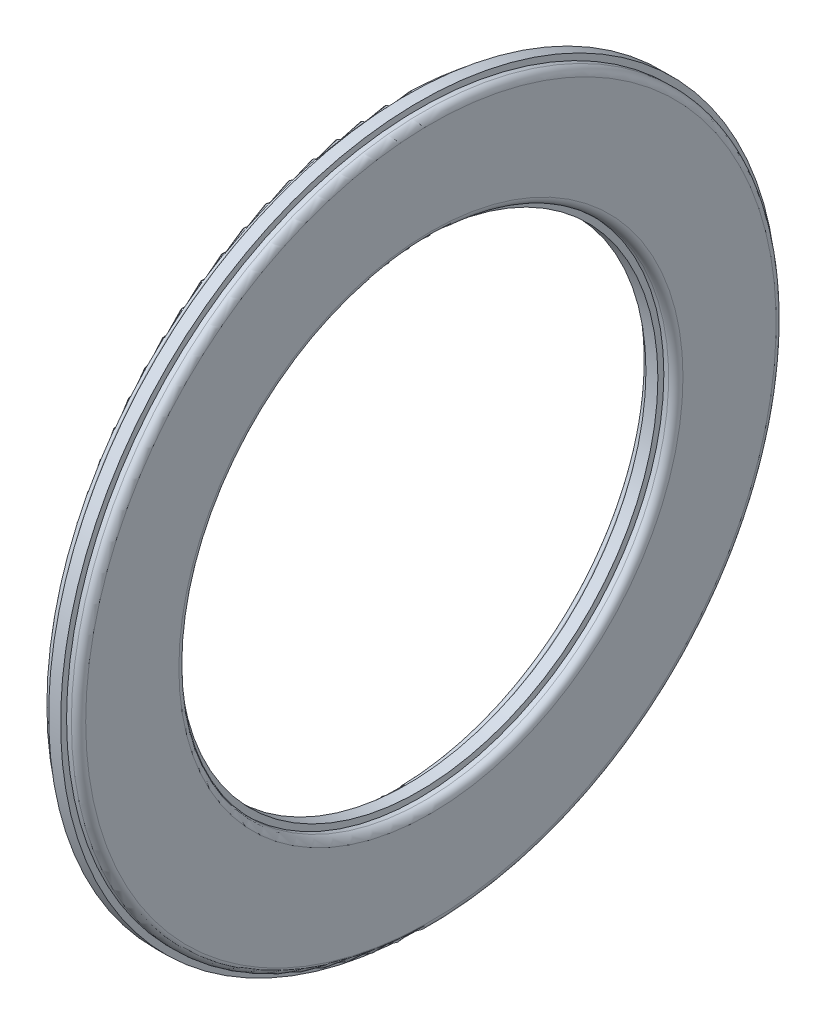
ISO-10303-21;
HEADER;
FILE_DESCRIPTION(('STEP AP214'),'2;1');
FILE_NAME('part.step','',(''),(''),'','','');
FILE_SCHEMA(('AUTOMOTIVE_DESIGN { 1 0 10303 214 1 1 1 1 }'));
ENDSEC;
DATA;
#1=APPLICATION_CONTEXT('core data for automotive mechanical design processes');
#2=APPLICATION_PROTOCOL_DEFINITION('international standard','automotive_design',2000,#1);
#3=PRODUCT_CONTEXT('',#1,'mechanical');
#4=PRODUCT('Part','Part','',(#3));
#5=PRODUCT_RELATED_PRODUCT_CATEGORY('part','',(#4));
#6=PRODUCT_DEFINITION_FORMATION('','',#4);
#7=PRODUCT_DEFINITION_CONTEXT('part definition',#1,'design');
#8=PRODUCT_DEFINITION('design','',#6,#7);
#9=PRODUCT_DEFINITION_SHAPE('','',#8);
#10=(LENGTH_UNIT() NAMED_UNIT(*) SI_UNIT(.MILLI.,.METRE.));
#11=(NAMED_UNIT(*) PLANE_ANGLE_UNIT() SI_UNIT($,.RADIAN.));
#12=(NAMED_UNIT(*) SI_UNIT($,.STERADIAN.) SOLID_ANGLE_UNIT());
#13=UNCERTAINTY_MEASURE_WITH_UNIT(LENGTH_MEASURE(1.E-05),#10,'distance_accuracy_value','');
#14=(GEOMETRIC_REPRESENTATION_CONTEXT(3) GLOBAL_UNCERTAINTY_ASSIGNED_CONTEXT((#13)) GLOBAL_UNIT_ASSIGNED_CONTEXT((#10,
#11,#12)) REPRESENTATION_CONTEXT('',''));
#15=CARTESIAN_POINT('',(0.,0.,0.));
#16=DIRECTION('',(0.,0.,1.));
#17=DIRECTION('',(1.,0.,0.));
#18=AXIS2_PLACEMENT_3D('',#15,#16,#17);
#19=CARTESIAN_POINT('',(-0.500000000000003,30.,0.));
#20=DIRECTION('',(-1.,0.,0.));
#21=DIRECTION('',(0.,0.,1.));
#22=AXIS2_PLACEMENT_3D('',#19,#20,#21);
#23=PLANE('',#22);
#24=CARTESIAN_POINT('',(-0.500000000000004,0.,0.));
#25=DIRECTION('',(-1.,0.,0.));
#26=DIRECTION('',(0.,0.,1.));
#27=AXIS2_PLACEMENT_3D('',#24,#25,#26);
#28=CIRCLE('',#27,20.5);
#29=CARTESIAN_POINT('',(-0.500000000000004,0.,20.5));
#30=VERTEX_POINT('',#29);
#31=EDGE_CURVE('E73',#30,#30,#28,.T.);
#32=ORIENTED_EDGE('',*,*,#31,.T.);
#33=EDGE_LOOP('',(#32));
#34=FACE_BOUND('',#33,.T.);
#35=CARTESIAN_POINT('',(-0.5,0.,0.));
#36=DIRECTION('',(1.,0.,0.));
#37=DIRECTION('',(0.,0.,-1.));
#38=AXIS2_PLACEMENT_3D('',#35,#36,#37);
#39=CIRCLE('',#38,20.);
#40=CARTESIAN_POINT('',(-0.5,0.,-20.));
#41=VERTEX_POINT('',#40);
#42=EDGE_CURVE('E10',#41,#41,#39,.T.);
#43=ORIENTED_EDGE('',*,*,#42,.T.);
#44=EDGE_LOOP('',(#43));
#45=FACE_BOUND('',#44,.T.);
#46=ADVANCED_FACE('F40',(#34,#45),#23,.T.);
#47=CARTESIAN_POINT('',(0.499999999999997,30.,0.));
#48=DIRECTION('',(1.,0.,0.));
#49=DIRECTION('',(0.,0.,-1.));
#50=AXIS2_PLACEMENT_3D('',#47,#48,#49);
#51=PLANE('',#50);
#52=CARTESIAN_POINT('',(0.499999999999997,0.,0.));
#53=DIRECTION('',(1.,0.,0.));
#54=DIRECTION('',(0.,0.,-1.));
#55=AXIS2_PLACEMENT_3D('',#52,#53,#54);
#56=CIRCLE('',#55,20.5);
#57=CARTESIAN_POINT('',(0.499999999999997,0.,-20.5));
#58=VERTEX_POINT('',#57);
#59=EDGE_CURVE('E41',#58,#58,#56,.T.);
#60=ORIENTED_EDGE('',*,*,#59,.T.);
#61=EDGE_LOOP('',(#60));
#62=FACE_BOUND('',#61,.T.);
#63=CARTESIAN_POINT('',(0.5,0.,0.));
#64=DIRECTION('',(1.,0.,0.));
#65=DIRECTION('',(0.,0.,-1.));
#66=AXIS2_PLACEMENT_3D('',#63,#64,#65);
#67=CIRCLE('',#66,20.);
#68=CARTESIAN_POINT('',(0.5,0.,-20.));
#69=VERTEX_POINT('',#68);
#70=EDGE_CURVE('E44',#69,#69,#67,.T.);
#71=ORIENTED_EDGE('',*,*,#70,.F.);
#72=EDGE_LOOP('',(#71));
#73=FACE_BOUND('',#72,.T.);
#74=ADVANCED_FACE('F93',(#62,#73),#51,.T.);
#75=CARTESIAN_POINT('',(-34.925,0.,0.));
#76=DIRECTION('',(1.,0.,0.));
#77=DIRECTION('',(0.,0.,-1.));
#78=AXIS2_PLACEMENT_3D('',#75,#76,#77);
#79=CYLINDRICAL_SURFACE('',#78,20.);
#80=ORIENTED_EDGE('',*,*,#70,.T.);
#81=EDGE_LOOP('',(#80));
#82=FACE_BOUND('',#81,.T.);
#83=ORIENTED_EDGE('',*,*,#42,.F.);
#84=EDGE_LOOP('',(#83));
#85=FACE_BOUND('',#84,.T.);
#86=ADVANCED_FACE('F99',(#82,#85),#79,.F.);
#87=CARTESIAN_POINT('',(0.899999999999997,0.,0.));
#88=DIRECTION('',(-1.,0.,0.));
#89=DIRECTION('',(0.,0.,1.));
#90=AXIS2_PLACEMENT_3D('',#87,#88,#89);
#91=TOROIDAL_SURFACE('',#90,21.1,0.600000000000002);
#92=CARTESIAN_POINT('',(1.5,0.,0.));
#93=DIRECTION('',(-1.,0.,0.));
#94=DIRECTION('',(0.,0.,1.));
#95=AXIS2_PLACEMENT_3D('',#92,#93,#94);
#96=CIRCLE('',#95,21.1);
#97=CARTESIAN_POINT('',(1.5,0.,21.1));
#98=VERTEX_POINT('',#97);
#99=EDGE_CURVE('E69',#98,#98,#96,.T.);
#100=ORIENTED_EDGE('',*,*,#99,.F.);
#101=EDGE_LOOP('',(#100));
#102=FACE_BOUND('',#101,.T.);
#103=CARTESIAN_POINT('',(0.899999999999998,0.,0.));
#104=DIRECTION('',(-1.,0.,0.));
#105=DIRECTION('',(0.,0.,1.));
#106=AXIS2_PLACEMENT_3D('',#103,#104,#105);
#107=CIRCLE('',#106,20.5);
#108=CARTESIAN_POINT('',(0.899999999999998,0.,20.5));
#109=VERTEX_POINT('',#108);
#110=EDGE_CURVE('E64',#109,#109,#107,.T.);
#111=ORIENTED_EDGE('',*,*,#110,.T.);
#112=EDGE_LOOP('',(#111));
#113=FACE_BOUND('',#112,.T.);
#114=ADVANCED_FACE('F125',(#102,#113),#91,.T.);
#115=CARTESIAN_POINT('',(-17.78,0.,0.));
#116=DIRECTION('',(-1.,0.,0.));
#117=DIRECTION('',(0.,0.,1.));
#118=AXIS2_PLACEMENT_3D('',#115,#116,#117);
#119=CYLINDRICAL_SURFACE('',#118,20.5);
#120=ORIENTED_EDGE('',*,*,#59,.F.);
#121=EDGE_LOOP('',(#120));
#122=FACE_BOUND('',#121,.T.);
#123=ORIENTED_EDGE('',*,*,#110,.F.);
#124=EDGE_LOOP('',(#123));
#125=FACE_BOUND('',#124,.T.);
#126=ADVANCED_FACE('F107',(#122,#125),#119,.F.);
#127=CARTESIAN_POINT('',(1.5,28.9,0.));
#128=DIRECTION('',(-1.,0.,0.));
#129=DIRECTION('',(0.,0.,1.));
#130=AXIS2_PLACEMENT_3D('',#127,#128,#129);
#131=PLANE('',#130);
#132=CARTESIAN_POINT('',(1.5,0.,0.));
#133=DIRECTION('',(-1.,0.,0.));
#134=DIRECTION('',(0.,0.,1.));
#135=AXIS2_PLACEMENT_3D('',#132,#133,#134);
#136=CIRCLE('',#135,28.9);
#137=CARTESIAN_POINT('',(1.5,0.,28.9));
#138=VERTEX_POINT('',#137);
#139=EDGE_CURVE('E251',#138,#138,#136,.T.);
#140=ORIENTED_EDGE('',*,*,#139,.F.);
#141=EDGE_LOOP('',(#140));
#142=FACE_BOUND('',#141,.T.);
#143=ORIENTED_EDGE('',*,*,#99,.T.);
#144=EDGE_LOOP('',(#143));
#145=FACE_BOUND('',#144,.T.);
#146=ADVANCED_FACE('F122',(#142,#145),#131,.F.);
#147=CARTESIAN_POINT('',(0.899999999999996,0.,0.));
#148=DIRECTION('',(-1.,0.,0.));
#149=DIRECTION('',(0.,0.,1.));
#150=AXIS2_PLACEMENT_3D('',#147,#148,#149);
#151=TOROIDAL_SURFACE('',#150,28.9,0.6);
#152=CARTESIAN_POINT('',(0.899999999999998,0.,0.));
#153=DIRECTION('',(-1.,0.,0.));
#154=DIRECTION('',(0.,0.,1.));
#155=AXIS2_PLACEMENT_3D('',#152,#153,#154);
#156=CIRCLE('',#155,29.5);
#157=CARTESIAN_POINT('',(0.899999999999998,0.,29.5));
#158=VERTEX_POINT('',#157);
#159=EDGE_CURVE('E247',#158,#158,#156,.T.);
#160=ORIENTED_EDGE('',*,*,#159,.F.);
#161=EDGE_LOOP('',(#160));
#162=FACE_BOUND('',#161,.T.);
#163=ORIENTED_EDGE('',*,*,#139,.T.);
#164=EDGE_LOOP('',(#163));
#165=FACE_BOUND('',#164,.T.);
#166=ADVANCED_FACE('F120',(#162,#165),#151,.T.);
#167=CARTESIAN_POINT('',(-17.78,0.,0.));
#168=DIRECTION('',(-1.,0.,0.));
#169=DIRECTION('',(0.,0.,1.));
#170=AXIS2_PLACEMENT_3D('',#167,#168,#169);
#171=CYLINDRICAL_SURFACE('',#170,29.5);
#172=CARTESIAN_POINT('',(0.499999999999997,0.,0.));
#173=DIRECTION('',(1.,0.,0.));
#174=DIRECTION('',(0.,0.,-1.));
#175=AXIS2_PLACEMENT_3D('',#172,#173,#174);
#176=CIRCLE('',#175,29.5);
#177=CARTESIAN_POINT('',(0.499999999999997,0.,-29.5));
#178=VERTEX_POINT('',#177);
#179=EDGE_CURVE('E52',#178,#178,#176,.F.);
#180=ORIENTED_EDGE('',*,*,#179,.F.);
#181=EDGE_LOOP('',(#180));
#182=FACE_BOUND('',#181,.T.);
#183=ORIENTED_EDGE('',*,*,#159,.T.);
#184=EDGE_LOOP('',(#183));
#185=FACE_BOUND('',#184,.T.);
#186=ADVANCED_FACE('F110',(#182,#185),#171,.T.);
#187=ORIENTED_EDGE('',*,*,#31,.F.);
#188=EDGE_LOOP('',(#187));
#189=FACE_BOUND('',#188,.T.);
#190=CARTESIAN_POINT('',(-0.900000000000001,0.,0.));
#191=DIRECTION('',(-1.,0.,0.));
#192=DIRECTION('',(0.,0.,1.));
#193=AXIS2_PLACEMENT_3D('',#190,#191,#192);
#194=CIRCLE('',#193,20.5);
#195=CARTESIAN_POINT('',(-0.900000000000001,0.,20.5));
#196=VERTEX_POINT('',#195);
#197=EDGE_CURVE('E57',#196,#196,#194,.T.);
#198=ORIENTED_EDGE('',*,*,#197,.T.);
#199=EDGE_LOOP('',(#198));
#200=FACE_BOUND('',#199,.T.);
#201=ADVANCED_FACE('F104',(#189,#200),#119,.F.);
#202=CARTESIAN_POINT('',(-0.500000000000004,0.,0.));
#203=DIRECTION('',(-1.,0.,0.));
#204=DIRECTION('',(0.,0.,1.));
#205=AXIS2_PLACEMENT_3D('',#202,#203,#204);
#206=CIRCLE('',#205,29.5);
#207=CARTESIAN_POINT('',(-0.500000000000004,0.,29.5));
#208=VERTEX_POINT('',#207);
#209=EDGE_CURVE('E54',#208,#208,#206,.F.);
#210=ORIENTED_EDGE('',*,*,#209,.F.);
#211=EDGE_LOOP('',(#210));
#212=FACE_BOUND('',#211,.T.);
#213=CARTESIAN_POINT('',(-0.900000000000005,0.,0.));
#214=DIRECTION('',(-1.,0.,0.));
#215=DIRECTION('',(0.,0.,1.));
#216=AXIS2_PLACEMENT_3D('',#213,#214,#215);
#217=CIRCLE('',#216,29.5);
#218=CARTESIAN_POINT('',(-0.900000000000005,0.,29.5));
#219=VERTEX_POINT('',#218);
#220=EDGE_CURVE('E244',#219,#219,#217,.T.);
#221=ORIENTED_EDGE('',*,*,#220,.F.);
#222=EDGE_LOOP('',(#221));
#223=FACE_BOUND('',#222,.T.);
#224=ADVANCED_FACE('F106',(#212,#223),#171,.T.);
#225=CARTESIAN_POINT('',(-0.900000000000003,0.,0.));
#226=DIRECTION('',(-1.,0.,0.));
#227=DIRECTION('',(0.,0.,1.));
#228=AXIS2_PLACEMENT_3D('',#225,#226,#227);
#229=TOROIDAL_SURFACE('',#228,21.1,0.600000000000002);
#230=ORIENTED_EDGE('',*,*,#197,.F.);
#231=EDGE_LOOP('',(#230));
#232=FACE_BOUND('',#231,.T.);
#233=CARTESIAN_POINT('',(-1.5,0.,0.));
#234=DIRECTION('',(-1.,0.,0.));
#235=DIRECTION('',(0.,0.,1.));
#236=AXIS2_PLACEMENT_3D('',#233,#234,#235);
#237=CIRCLE('',#236,21.1);
#238=CARTESIAN_POINT('',(-1.5,0.,21.1));
#239=VERTEX_POINT('',#238);
#240=EDGE_CURVE('E241',#239,#239,#237,.T.);
#241=ORIENTED_EDGE('',*,*,#240,.T.);
#242=EDGE_LOOP('',(#241));
#243=FACE_BOUND('',#242,.T.);
#244=ADVANCED_FACE('F112',(#232,#243),#229,.T.);
#245=CARTESIAN_POINT('',(-0.900000000000004,0.,0.));
#246=DIRECTION('',(-1.,0.,0.));
#247=DIRECTION('',(0.,0.,1.));
#248=AXIS2_PLACEMENT_3D('',#245,#246,#247);
#249=TOROIDAL_SURFACE('',#248,28.9,0.6);
#250=CARTESIAN_POINT('',(-1.5,0.,0.));
#251=DIRECTION('',(-1.,0.,0.));
#252=DIRECTION('',(0.,0.,1.));
#253=AXIS2_PLACEMENT_3D('',#250,#251,#252);
#254=CIRCLE('',#253,28.9);
#255=CARTESIAN_POINT('',(-1.5,0.,28.9));
#256=VERTEX_POINT('',#255);
#257=EDGE_CURVE('E242',#256,#256,#254,.T.);
#258=ORIENTED_EDGE('',*,*,#257,.F.);
#259=EDGE_LOOP('',(#258));
#260=FACE_BOUND('',#259,.T.);
#261=ORIENTED_EDGE('',*,*,#220,.T.);
#262=EDGE_LOOP('',(#261));
#263=FACE_BOUND('',#262,.T.);
#264=ADVANCED_FACE('F218',(#260,#263),#249,.T.);
#265=CARTESIAN_POINT('',(-1.5,28.9,0.));
#266=DIRECTION('',(1.,0.,0.));
#267=DIRECTION('',(0.,0.,-1.));
#268=AXIS2_PLACEMENT_3D('',#265,#266,#267);
#269=PLANE('',#268);
#270=ORIENTED_EDGE('',*,*,#240,.F.);
#271=EDGE_LOOP('',(#270));
#272=FACE_BOUND('',#271,.T.);
#273=ORIENTED_EDGE('',*,*,#257,.T.);
#274=EDGE_LOOP('',(#273));
#275=FACE_BOUND('',#274,.T.);
#276=ADVANCED_FACE('F91',(#272,#275),#269,.F.);
#277=ORIENTED_EDGE('',*,*,#209,.T.);
#278=EDGE_LOOP('',(#277));
#279=FACE_BOUND('',#278,.T.);
#280=CARTESIAN_POINT('',(-0.5,0.,0.));
#281=DIRECTION('',(1.,0.,0.));
#282=DIRECTION('',(0.,0.,-1.));
#283=AXIS2_PLACEMENT_3D('',#280,#281,#282);
#284=CIRCLE('',#283,30.);
#285=CARTESIAN_POINT('',(-0.5,0.,-30.));
#286=VERTEX_POINT('',#285);
#287=EDGE_CURVE('E72',#286,#286,#284,.T.);
#288=ORIENTED_EDGE('',*,*,#287,.F.);
#289=EDGE_LOOP('',(#288));
#290=FACE_BOUND('',#289,.T.);
#291=ADVANCED_FACE('F39',(#279,#290),#23,.T.);
#292=CARTESIAN_POINT('',(-34.925,0.,0.));
#293=DIRECTION('',(1.,0.,0.));
#294=DIRECTION('',(0.,0.,-1.));
#295=AXIS2_PLACEMENT_3D('',#292,#293,#294);
#296=CYLINDRICAL_SURFACE('',#295,30.);
#297=ORIENTED_EDGE('',*,*,#287,.T.);
#298=EDGE_LOOP('',(#297));
#299=FACE_BOUND('',#298,.T.);
#300=CARTESIAN_POINT('',(0.499999999999994,0.,0.));
#301=DIRECTION('',(1.,0.,0.));
#302=DIRECTION('',(0.,0.,-1.));
#303=AXIS2_PLACEMENT_3D('',#300,#301,#302);
#304=CIRCLE('',#303,30.);
#305=CARTESIAN_POINT('',(0.499999999999994,0.,-30.));
#306=VERTEX_POINT('',#305);
#307=EDGE_CURVE('E49',#306,#306,#304,.T.);
#308=ORIENTED_EDGE('',*,*,#307,.F.);
#309=EDGE_LOOP('',(#308));
#310=FACE_BOUND('',#309,.T.);
#311=ADVANCED_FACE('F83',(#299,#310),#296,.T.);
#312=ORIENTED_EDGE('',*,*,#179,.T.);
#313=EDGE_LOOP('',(#312));
#314=FACE_BOUND('',#313,.T.);
#315=ORIENTED_EDGE('',*,*,#307,.T.);
#316=EDGE_LOOP('',(#315));
#317=FACE_BOUND('',#316,.T.);
#318=ADVANCED_FACE('F79',(#314,#317),#51,.T.);
#319=CLOSED_SHELL('',(#46,#74,#86,#114,#126,#146,#166,#186,#201,#224,#244,#264,#276,#291,#311,#318));
#320=MANIFOLD_SOLID_BREP('B2',#319);
#321=ADVANCED_BREP_SHAPE_REPRESENTATION('',(#18,#320),#14);
#322=SHAPE_DEFINITION_REPRESENTATION(#9,#321);
ENDSEC;
END-ISO-10303-21;
